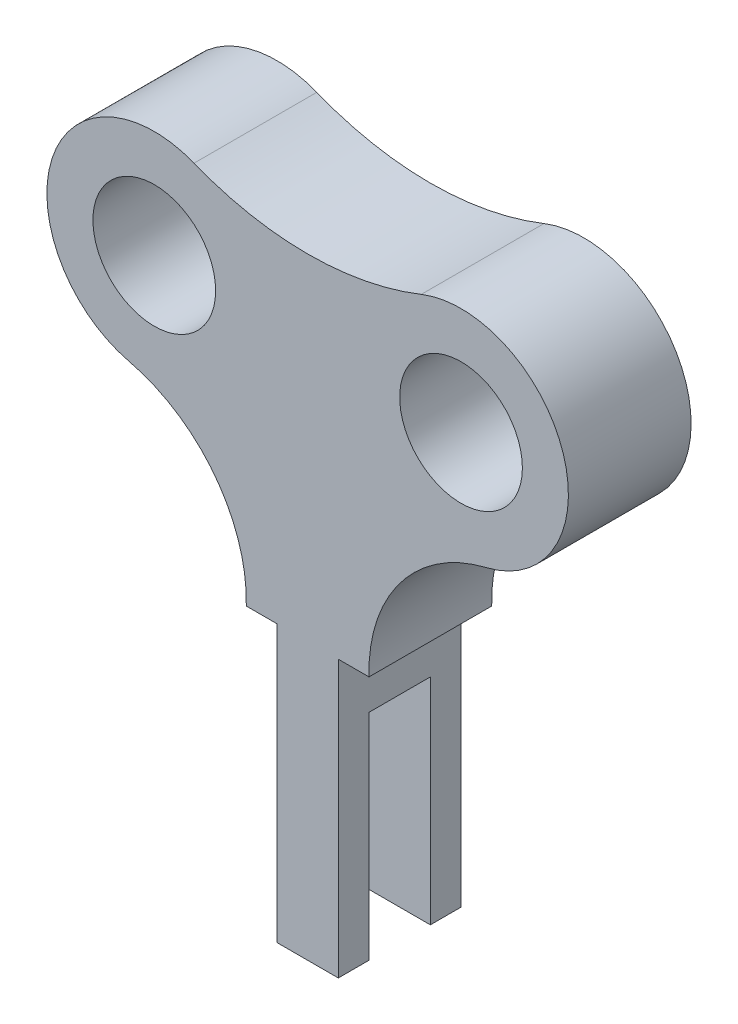
ISO-10303-21;
HEADER;
FILE_DESCRIPTION(('STEP AP214'),'2;1');
FILE_NAME('part.step','',(''),(''),'','','');
FILE_SCHEMA(('AUTOMOTIVE_DESIGN { 1 0 10303 214 1 1 1 1 }'));
ENDSEC;
DATA;
#1=APPLICATION_CONTEXT('core data for automotive mechanical design processes');
#2=APPLICATION_PROTOCOL_DEFINITION('international standard','automotive_design',2000,#1);
#3=PRODUCT_CONTEXT('',#1,'mechanical');
#4=PRODUCT('Part','Part','',(#3));
#5=PRODUCT_RELATED_PRODUCT_CATEGORY('part','',(#4));
#6=PRODUCT_DEFINITION_FORMATION('','',#4);
#7=PRODUCT_DEFINITION_CONTEXT('part definition',#1,'design');
#8=PRODUCT_DEFINITION('design','',#6,#7);
#9=PRODUCT_DEFINITION_SHAPE('','',#8);
#10=(LENGTH_UNIT() NAMED_UNIT(*) SI_UNIT(.MILLI.,.METRE.));
#11=(NAMED_UNIT(*) PLANE_ANGLE_UNIT() SI_UNIT($,.RADIAN.));
#12=(NAMED_UNIT(*) SI_UNIT($,.STERADIAN.) SOLID_ANGLE_UNIT());
#13=UNCERTAINTY_MEASURE_WITH_UNIT(LENGTH_MEASURE(1.E-05),#10,'distance_accuracy_value','');
#14=(GEOMETRIC_REPRESENTATION_CONTEXT(3) GLOBAL_UNCERTAINTY_ASSIGNED_CONTEXT((#13)) GLOBAL_UNIT_ASSIGNED_CONTEXT((#10,
#11,#12)) REPRESENTATION_CONTEXT('',''));
#15=CARTESIAN_POINT('',(0.,0.,0.));
#16=DIRECTION('',(0.,0.,1.));
#17=DIRECTION('',(1.,0.,0.));
#18=AXIS2_PLACEMENT_3D('',#15,#16,#17);
#19=CARTESIAN_POINT('',(5.,-50.1008204542105,-10.));
#20=DIRECTION('',(0.,-1.,0.));
#21=DIRECTION('',(0.,0.,-1.));
#22=AXIS2_PLACEMENT_3D('',#19,#20,#21);
#23=PLANE('',#22);
#24=DIRECTION('',(1.,0.,0.));
#25=VECTOR('',#24,1.);
#26=CARTESIAN_POINT('',(-5.,-50.1008204542105,-5.));
#27=LINE('',#26,#25);
#28=CARTESIAN_POINT('',(-5.,-50.1008204542105,-5.));
#29=VERTEX_POINT('',#28);
#30=CARTESIAN_POINT('',(5.,-50.1008204542105,-5.));
#31=VERTEX_POINT('',#30);
#32=EDGE_CURVE('E156',#29,#31,#27,.T.);
#33=ORIENTED_EDGE('',*,*,#32,.F.);
#34=DIRECTION('',(0.,0.,1.));
#35=VECTOR('',#34,1.);
#36=CARTESIAN_POINT('',(-5.,-50.1008204542105,-10.));
#37=LINE('',#36,#35);
#38=CARTESIAN_POINT('',(-5.,-50.1008204542105,-10.));
#39=VERTEX_POINT('',#38);
#40=EDGE_CURVE('E248',#39,#29,#37,.T.);
#41=ORIENTED_EDGE('',*,*,#40,.F.);
#42=DIRECTION('',(1.,0.,0.));
#43=VECTOR('',#42,1.);
#44=CARTESIAN_POINT('',(5.,-50.1008204542105,-10.));
#45=LINE('',#44,#43);
#46=CARTESIAN_POINT('',(5.,-50.1008204542105,-10.));
#47=VERTEX_POINT('',#46);
#48=EDGE_CURVE('E225',#39,#47,#45,.T.);
#49=ORIENTED_EDGE('',*,*,#48,.T.);
#50=DIRECTION('',(0.,0.,1.));
#51=VECTOR('',#50,1.);
#52=CARTESIAN_POINT('',(5.,-50.1008204542105,-10.));
#53=LINE('',#52,#51);
#54=EDGE_CURVE('E245',#47,#31,#53,.T.);
#55=ORIENTED_EDGE('',*,*,#54,.T.);
#56=EDGE_LOOP('',(#33,#41,#49,#55));
#57=FACE_BOUND('',#56,.T.);
#58=ADVANCED_FACE('F39',(#57),#23,.T.);
#59=CARTESIAN_POINT('',(0.,99.5988605657117,-10.));
#60=DIRECTION('',(0.,0.,1.));
#61=DIRECTION('',(1.,0.,0.));
#62=AXIS2_PLACEMENT_3D('',#59,#60,#61);
#63=CYLINDRICAL_SURFACE('',#62,50.);
#64=DIRECTION('',(0.,0.,1.));
#65=VECTOR('',#64,1.);
#66=CARTESIAN_POINT('',(-18.5185185185185,53.1546524028064,-10.));
#67=LINE('',#66,#65);
#68=CARTESIAN_POINT('',(-18.5185185185185,53.1546524028064,-10.));
#69=VERTEX_POINT('',#68);
#70=CARTESIAN_POINT('',(-18.5185185185185,53.1546524028064,10.));
#71=VERTEX_POINT('',#70);
#72=EDGE_CURVE('E43',#69,#71,#67,.T.);
#73=ORIENTED_EDGE('',*,*,#72,.T.);
#74=CARTESIAN_POINT('',(0.,99.5988605657117,10.));
#75=DIRECTION('',(0.,0.,-1.));
#76=DIRECTION('',(1.,0.,0.));
#77=AXIS2_PLACEMENT_3D('',#74,#75,#76);
#78=CIRCLE('',#77,50.);
#79=CARTESIAN_POINT('',(18.5185185185185,53.1546524028064,10.));
#80=VERTEX_POINT('',#79);
#81=EDGE_CURVE('E175',#80,#71,#78,.T.);
#82=ORIENTED_EDGE('',*,*,#81,.F.);
#83=DIRECTION('',(0.,0.,1.));
#84=VECTOR('',#83,1.);
#85=CARTESIAN_POINT('',(18.5185185185185,53.1546524028064,-10.));
#86=LINE('',#85,#84);
#87=CARTESIAN_POINT('',(18.5185185185185,53.1546524028064,-10.));
#88=VERTEX_POINT('',#87);
#89=EDGE_CURVE('E11',#88,#80,#86,.T.);
#90=ORIENTED_EDGE('',*,*,#89,.F.);
#91=CARTESIAN_POINT('',(0.,99.5988605657117,-10.));
#92=DIRECTION('',(0.,0.,-1.));
#93=DIRECTION('',(1.,0.,0.));
#94=AXIS2_PLACEMENT_3D('',#91,#92,#93);
#95=CIRCLE('',#94,50.);
#96=EDGE_CURVE('E211',#88,#69,#95,.T.);
#97=ORIENTED_EDGE('',*,*,#96,.T.);
#98=EDGE_LOOP('',(#73,#82,#90,#97));
#99=FACE_BOUND('',#98,.T.);
#100=ADVANCED_FACE('F41',(#99),#63,.F.);
#101=CARTESIAN_POINT('',(25.,36.8991795457895,-10.));
#102=DIRECTION('',(0.,0.,1.));
#103=DIRECTION('',(1.,0.,0.));
#104=AXIS2_PLACEMENT_3D('',#101,#102,#103);
#105=CYLINDRICAL_SURFACE('',#104,17.5);
#106=ORIENTED_EDGE('',*,*,#89,.T.);
#107=CARTESIAN_POINT('',(25.,36.8991795457895,10.));
#108=DIRECTION('',(0.,0.,1.));
#109=DIRECTION('',(1.,0.,0.));
#110=AXIS2_PLACEMENT_3D('',#107,#108,#109);
#111=CIRCLE('',#110,17.5);
#112=CARTESIAN_POINT('',(29.1137151317504,19.8895543936938,10.));
#113=VERTEX_POINT('',#112);
#114=EDGE_CURVE('E202',#113,#80,#111,.T.);
#115=ORIENTED_EDGE('',*,*,#114,.F.);
#116=DIRECTION('',(0.,0.,1.));
#117=VECTOR('',#116,1.);
#118=CARTESIAN_POINT('',(29.1137151317504,19.8895543936938,-10.));
#119=LINE('',#118,#117);
#120=CARTESIAN_POINT('',(29.1137151317504,19.8895543936938,-10.));
#121=VERTEX_POINT('',#120);
#122=EDGE_CURVE('E48',#121,#113,#119,.T.);
#123=ORIENTED_EDGE('',*,*,#122,.F.);
#124=CARTESIAN_POINT('',(25.,36.8991795457895,-10.));
#125=DIRECTION('',(0.,0.,1.));
#126=DIRECTION('',(1.,0.,0.));
#127=AXIS2_PLACEMENT_3D('',#124,#125,#126);
#128=CIRCLE('',#127,17.5);
#129=EDGE_CURVE('E237',#121,#88,#128,.T.);
#130=ORIENTED_EDGE('',*,*,#129,.T.);
#131=EDGE_LOOP('',(#106,#115,#123,#130));
#132=FACE_BOUND('',#131,.T.);
#133=ADVANCED_FACE('F267',(#132),#105,.T.);
#134=CARTESIAN_POINT('',(34.990451034251,-4.40991010930014,-10.));
#135=DIRECTION('',(0.,0.,1.));
#136=DIRECTION('',(1.,0.,0.));
#137=AXIS2_PLACEMENT_3D('',#134,#135,#136);
#138=CYLINDRICAL_SURFACE('',#137,25.);
#139=ORIENTED_EDGE('',*,*,#122,.T.);
#140=CARTESIAN_POINT('',(34.990451034251,-4.40991010930014,10.));
#141=DIRECTION('',(0.,0.,-1.));
#142=DIRECTION('',(1.,0.,0.));
#143=AXIS2_PLACEMENT_3D('',#140,#141,#142);
#144=CIRCLE('',#143,25.);
#145=CARTESIAN_POINT('',(9.99999999999999,-5.1008204542105,10.));
#146=VERTEX_POINT('',#145);
#147=EDGE_CURVE('E199',#146,#113,#144,.T.);
#148=ORIENTED_EDGE('',*,*,#147,.F.);
#149=DIRECTION('',(0.,0.,1.));
#150=VECTOR('',#149,1.);
#151=CARTESIAN_POINT('',(9.99999999999999,-5.1008204542105,-10.));
#152=LINE('',#151,#150);
#153=CARTESIAN_POINT('',(9.99999999999999,-5.1008204542105,-10.));
#154=VERTEX_POINT('',#153);
#155=EDGE_CURVE('E241',#154,#146,#152,.T.);
#156=ORIENTED_EDGE('',*,*,#155,.F.);
#157=CARTESIAN_POINT('',(34.990451034251,-4.40991010930014,-10.));
#158=DIRECTION('',(0.,0.,-1.));
#159=DIRECTION('',(1.,0.,0.));
#160=AXIS2_PLACEMENT_3D('',#157,#158,#159);
#161=CIRCLE('',#160,25.);
#162=EDGE_CURVE('E234',#154,#121,#161,.T.);
#163=ORIENTED_EDGE('',*,*,#162,.T.);
#164=EDGE_LOOP('',(#139,#148,#156,#163));
#165=FACE_BOUND('',#164,.T.);
#166=ADVANCED_FACE('F301',(#165),#138,.F.);
#167=CARTESIAN_POINT('',(4.99999999999999,-5.10082045421049,-10.));
#168=DIRECTION('',(0.,-1.,0.));
#169=DIRECTION('',(1.,0.,0.));
#170=AXIS2_PLACEMENT_3D('',#167,#168,#169);
#171=PLANE('',#170);
#172=ORIENTED_EDGE('',*,*,#155,.T.);
#173=DIRECTION('',(1.,0.,0.));
#174=VECTOR('',#173,1.);
#175=CARTESIAN_POINT('',(4.99999999999999,-5.10082045421049,10.));
#176=LINE('',#175,#174);
#177=CARTESIAN_POINT('',(4.99999999999999,-5.10082045421049,10.));
#178=VERTEX_POINT('',#177);
#179=EDGE_CURVE('E196',#178,#146,#176,.T.);
#180=ORIENTED_EDGE('',*,*,#179,.F.);
#181=DIRECTION('',(0.,0.,1.));
#182=VECTOR('',#181,1.);
#183=CARTESIAN_POINT('',(4.99999999999999,-5.10082045421049,-10.));
#184=LINE('',#183,#182);
#185=CARTESIAN_POINT('',(4.99999999999999,-5.10082045421049,-10.));
#186=VERTEX_POINT('',#185);
#187=EDGE_CURVE('E243',#186,#178,#184,.T.);
#188=ORIENTED_EDGE('',*,*,#187,.F.);
#189=DIRECTION('',(1.,0.,0.));
#190=VECTOR('',#189,1.);
#191=CARTESIAN_POINT('',(4.99999999999999,-5.10082045421049,-10.));
#192=LINE('',#191,#190);
#193=EDGE_CURVE('E231',#186,#154,#192,.T.);
#194=ORIENTED_EDGE('',*,*,#193,.T.);
#195=EDGE_LOOP('',(#172,#180,#188,#194));
#196=FACE_BOUND('',#195,.T.);
#197=ADVANCED_FACE('F299',(#196),#171,.T.);
#198=CARTESIAN_POINT('',(5.,-50.1008204542105,-10.));
#199=DIRECTION('',(1.,0.,0.));
#200=DIRECTION('',(0.,1.,0.));
#201=AXIS2_PLACEMENT_3D('',#198,#199,#200);
#202=PLANE('',#201);
#203=DIRECTION('',(0.,-1.,0.));
#204=VECTOR('',#203,1.);
#205=CARTESIAN_POINT('',(5.,-15.1008204542105,-5.));
#206=LINE('',#205,#204);
#207=CARTESIAN_POINT('',(5.,-15.1008204542105,-5.));
#208=VERTEX_POINT('',#207);
#209=EDGE_CURVE('E172',#208,#31,#206,.T.);
#210=ORIENTED_EDGE('',*,*,#209,.T.);
#211=ORIENTED_EDGE('',*,*,#54,.F.);
#212=DIRECTION('',(0.,1.,0.));
#213=VECTOR('',#212,1.);
#214=CARTESIAN_POINT('',(5.,-50.1008204542105,-10.));
#215=LINE('',#214,#213);
#216=EDGE_CURVE('E228',#47,#186,#215,.T.);
#217=ORIENTED_EDGE('',*,*,#216,.T.);
#218=ORIENTED_EDGE('',*,*,#187,.T.);
#219=DIRECTION('',(0.,1.,0.));
#220=VECTOR('',#219,1.);
#221=CARTESIAN_POINT('',(5.,-50.1008204542105,10.));
#222=LINE('',#221,#220);
#223=CARTESIAN_POINT('',(5.,-50.1008204542105,10.));
#224=VERTEX_POINT('',#223);
#225=EDGE_CURVE('E193',#224,#178,#222,.T.);
#226=ORIENTED_EDGE('',*,*,#225,.F.);
#227=CARTESIAN_POINT('',(5.,-50.1008204542105,5.));
#228=VERTEX_POINT('',#227);
#229=EDGE_CURVE('E161',#228,#224,#53,.T.);
#230=ORIENTED_EDGE('',*,*,#229,.F.);
#231=DIRECTION('',(0.,-1.,0.));
#232=VECTOR('',#231,1.);
#233=CARTESIAN_POINT('',(5.,-15.1008204542105,5.));
#234=LINE('',#233,#232);
#235=CARTESIAN_POINT('',(5.,-15.1008204542105,5.));
#236=VERTEX_POINT('',#235);
#237=EDGE_CURVE('E141',#236,#228,#234,.T.);
#238=ORIENTED_EDGE('',*,*,#237,.F.);
#239=DIRECTION('',(0.,0.,1.));
#240=VECTOR('',#239,1.);
#241=CARTESIAN_POINT('',(5.,-15.1008204542105,5.));
#242=LINE('',#241,#240);
#243=EDGE_CURVE('E147',#208,#236,#242,.T.);
#244=ORIENTED_EDGE('',*,*,#243,.F.);
#245=EDGE_LOOP('',(#210,#211,#217,#218,#226,#230,#238,#244));
#246=FACE_BOUND('',#245,.T.);
#247=ADVANCED_FACE('F159',(#246),#202,.T.);
#248=DIRECTION('',(-1.,0.,0.));
#249=VECTOR('',#248,1.);
#250=CARTESIAN_POINT('',(-5.,-50.1008204542105,5.));
#251=LINE('',#250,#249);
#252=CARTESIAN_POINT('',(-5.,-50.1008204542105,5.));
#253=VERTEX_POINT('',#252);
#254=EDGE_CURVE('E293',#228,#253,#251,.T.);
#255=ORIENTED_EDGE('',*,*,#254,.F.);
#256=ORIENTED_EDGE('',*,*,#229,.T.);
#257=DIRECTION('',(1.,0.,0.));
#258=VECTOR('',#257,1.);
#259=CARTESIAN_POINT('',(5.,-50.1008204542105,10.));
#260=LINE('',#259,#258);
#261=CARTESIAN_POINT('',(-5.,-50.1008204542105,10.));
#262=VERTEX_POINT('',#261);
#263=EDGE_CURVE('E190',#262,#224,#260,.T.);
#264=ORIENTED_EDGE('',*,*,#263,.F.);
#265=EDGE_CURVE('E251',#253,#262,#37,.T.);
#266=ORIENTED_EDGE('',*,*,#265,.F.);
#267=EDGE_LOOP('',(#255,#256,#264,#266));
#268=FACE_BOUND('',#267,.T.);
#269=ADVANCED_FACE('F312',(#268),#23,.T.);
#270=CARTESIAN_POINT('',(-5.,-50.1008204542105,-10.));
#271=DIRECTION('',(-1.,0.,0.));
#272=DIRECTION('',(0.,-1.,0.));
#273=AXIS2_PLACEMENT_3D('',#270,#271,#272);
#274=PLANE('',#273);
#275=DIRECTION('',(0.,-1.,0.));
#276=VECTOR('',#275,1.);
#277=CARTESIAN_POINT('',(-5.,-15.1008204542105,-5.));
#278=LINE('',#277,#276);
#279=CARTESIAN_POINT('',(-5.,-15.1008204542105,-5.));
#280=VERTEX_POINT('',#279);
#281=EDGE_CURVE('E163',#280,#29,#278,.T.);
#282=ORIENTED_EDGE('',*,*,#281,.F.);
#283=DIRECTION('',(0.,0.,-1.));
#284=VECTOR('',#283,1.);
#285=CARTESIAN_POINT('',(-5.,-15.1008204542105,5.));
#286=LINE('',#285,#284);
#287=CARTESIAN_POINT('',(-4.99999999999999,-15.1008204542105,5.));
#288=VERTEX_POINT('',#287);
#289=EDGE_CURVE('E146',#288,#280,#286,.T.);
#290=ORIENTED_EDGE('',*,*,#289,.F.);
#291=DIRECTION('',(0.,-1.,0.));
#292=VECTOR('',#291,1.);
#293=CARTESIAN_POINT('',(-5.,-15.1008204542105,5.));
#294=LINE('',#293,#292);
#295=EDGE_CURVE('E144',#288,#253,#294,.T.);
#296=ORIENTED_EDGE('',*,*,#295,.T.);
#297=ORIENTED_EDGE('',*,*,#265,.T.);
#298=DIRECTION('',(0.,-1.,0.));
#299=VECTOR('',#298,1.);
#300=CARTESIAN_POINT('',(-5.,-50.1008204542105,10.));
#301=LINE('',#300,#299);
#302=CARTESIAN_POINT('',(-4.99999999999999,-5.10082045421049,10.));
#303=VERTEX_POINT('',#302);
#304=EDGE_CURVE('E187',#303,#262,#301,.T.);
#305=ORIENTED_EDGE('',*,*,#304,.F.);
#306=DIRECTION('',(0.,0.,1.));
#307=VECTOR('',#306,1.);
#308=CARTESIAN_POINT('',(-4.99999999999999,-5.10082045421049,-10.));
#309=LINE('',#308,#307);
#310=CARTESIAN_POINT('',(-4.99999999999999,-5.10082045421049,-10.));
#311=VERTEX_POINT('',#310);
#312=EDGE_CURVE('E252',#311,#303,#309,.T.);
#313=ORIENTED_EDGE('',*,*,#312,.F.);
#314=DIRECTION('',(0.,-1.,0.));
#315=VECTOR('',#314,1.);
#316=CARTESIAN_POINT('',(-5.,-50.1008204542105,-10.));
#317=LINE('',#316,#315);
#318=EDGE_CURVE('E222',#311,#39,#317,.T.);
#319=ORIENTED_EDGE('',*,*,#318,.T.);
#320=ORIENTED_EDGE('',*,*,#40,.T.);
#321=EDGE_LOOP('',(#282,#290,#296,#297,#305,#313,#319,#320));
#322=FACE_BOUND('',#321,.T.);
#323=ADVANCED_FACE('F284',(#322),#274,.T.);
#324=CARTESIAN_POINT('',(-4.99999999999999,-5.10082045421049,-10.));
#325=DIRECTION('',(0.,-1.,0.));
#326=DIRECTION('',(1.,0.,0.));
#327=AXIS2_PLACEMENT_3D('',#324,#325,#326);
#328=PLANE('',#327);
#329=ORIENTED_EDGE('',*,*,#312,.T.);
#330=DIRECTION('',(1.,0.,0.));
#331=VECTOR('',#330,1.);
#332=CARTESIAN_POINT('',(-4.99999999999999,-5.10082045421049,10.));
#333=LINE('',#332,#331);
#334=CARTESIAN_POINT('',(-9.99999999999999,-5.10082045421049,10.));
#335=VERTEX_POINT('',#334);
#336=EDGE_CURVE('E184',#335,#303,#333,.T.);
#337=ORIENTED_EDGE('',*,*,#336,.F.);
#338=DIRECTION('',(0.,0.,1.));
#339=VECTOR('',#338,1.);
#340=CARTESIAN_POINT('',(-9.99999999999999,-5.10082045421049,-10.));
#341=LINE('',#340,#339);
#342=CARTESIAN_POINT('',(-9.99999999999999,-5.10082045421049,-10.));
#343=VERTEX_POINT('',#342);
#344=EDGE_CURVE('E254',#343,#335,#341,.T.);
#345=ORIENTED_EDGE('',*,*,#344,.F.);
#346=DIRECTION('',(1.,0.,0.));
#347=VECTOR('',#346,1.);
#348=CARTESIAN_POINT('',(-4.99999999999999,-5.10082045421049,-10.));
#349=LINE('',#348,#347);
#350=EDGE_CURVE('E219',#343,#311,#349,.T.);
#351=ORIENTED_EDGE('',*,*,#350,.T.);
#352=EDGE_LOOP('',(#329,#337,#345,#351));
#353=FACE_BOUND('',#352,.T.);
#354=ADVANCED_FACE('F281',(#353),#328,.T.);
#355=CARTESIAN_POINT('',(-34.990451034251,-4.40991010930014,-10.));
#356=DIRECTION('',(0.,0.,1.));
#357=DIRECTION('',(1.,0.,0.));
#358=AXIS2_PLACEMENT_3D('',#355,#356,#357);
#359=CYLINDRICAL_SURFACE('',#358,25.);
#360=ORIENTED_EDGE('',*,*,#344,.T.);
#361=CARTESIAN_POINT('',(-34.990451034251,-4.40991010930014,10.));
#362=DIRECTION('',(0.,0.,-1.));
#363=DIRECTION('',(-1.,0.,0.));
#364=AXIS2_PLACEMENT_3D('',#361,#362,#363);
#365=CIRCLE('',#364,25.);
#366=CARTESIAN_POINT('',(-29.1137151317504,19.8895543936938,10.));
#367=VERTEX_POINT('',#366);
#368=EDGE_CURVE('E181',#367,#335,#365,.T.);
#369=ORIENTED_EDGE('',*,*,#368,.F.);
#370=DIRECTION('',(0.,0.,1.));
#371=VECTOR('',#370,1.);
#372=CARTESIAN_POINT('',(-29.1137151317504,19.8895543936938,-10.));
#373=LINE('',#372,#371);
#374=CARTESIAN_POINT('',(-29.1137151317504,19.8895543936938,-10.));
#375=VERTEX_POINT('',#374);
#376=EDGE_CURVE('E255',#375,#367,#373,.T.);
#377=ORIENTED_EDGE('',*,*,#376,.F.);
#378=CARTESIAN_POINT('',(-34.990451034251,-4.40991010930014,-10.));
#379=DIRECTION('',(0.,0.,-1.));
#380=DIRECTION('',(-1.,0.,0.));
#381=AXIS2_PLACEMENT_3D('',#378,#379,#380);
#382=CIRCLE('',#381,25.);
#383=EDGE_CURVE('E216',#375,#343,#382,.T.);
#384=ORIENTED_EDGE('',*,*,#383,.T.);
#385=EDGE_LOOP('',(#360,#369,#377,#384));
#386=FACE_BOUND('',#385,.T.);
#387=ADVANCED_FACE('F277',(#386),#359,.F.);
#388=CARTESIAN_POINT('',(-25.,36.8991795457895,-10.));
#389=DIRECTION('',(0.,0.,1.));
#390=DIRECTION('',(1.,0.,0.));
#391=AXIS2_PLACEMENT_3D('',#388,#389,#390);
#392=CYLINDRICAL_SURFACE('',#391,17.5);
#393=ORIENTED_EDGE('',*,*,#376,.T.);
#394=CARTESIAN_POINT('',(-25.,36.8991795457895,10.));
#395=DIRECTION('',(0.,0.,1.));
#396=DIRECTION('',(1.,0.,0.));
#397=AXIS2_PLACEMENT_3D('',#394,#395,#396);
#398=CIRCLE('',#397,17.5);
#399=EDGE_CURVE('E178',#71,#367,#398,.T.);
#400=ORIENTED_EDGE('',*,*,#399,.F.);
#401=ORIENTED_EDGE('',*,*,#72,.F.);
#402=CARTESIAN_POINT('',(-25.,36.8991795457895,-10.));
#403=DIRECTION('',(0.,0.,1.));
#404=DIRECTION('',(1.,0.,0.));
#405=AXIS2_PLACEMENT_3D('',#402,#403,#404);
#406=CIRCLE('',#405,17.5);
#407=EDGE_CURVE('E213',#69,#375,#406,.T.);
#408=ORIENTED_EDGE('',*,*,#407,.T.);
#409=EDGE_LOOP('',(#393,#400,#401,#408));
#410=FACE_BOUND('',#409,.T.);
#411=ADVANCED_FACE('F259',(#410),#392,.T.);
#412=CARTESIAN_POINT('',(0.,99.5988605657117,-10.));
#413=DIRECTION('',(0.,0.,1.));
#414=DIRECTION('',(1.,0.,0.));
#415=AXIS2_PLACEMENT_3D('',#412,#413,#414);
#416=PLANE('',#415);
#417=CARTESIAN_POINT('',(25.,36.8991795457895,-10.));
#418=DIRECTION('',(0.,0.,1.));
#419=DIRECTION('',(1.,0.,0.));
#420=AXIS2_PLACEMENT_3D('',#417,#418,#419);
#421=CIRCLE('',#420,10.);
#422=CARTESIAN_POINT('',(35.,36.8991795457895,-10.));
#423=VERTEX_POINT('',#422);
#424=EDGE_CURVE('E205',#423,#423,#421,.T.);
#425=ORIENTED_EDGE('',*,*,#424,.T.);
#426=EDGE_LOOP('',(#425));
#427=FACE_BOUND('',#426,.T.);
#428=CARTESIAN_POINT('',(-25.,36.8991795457895,-10.));
#429=DIRECTION('',(0.,0.,1.));
#430=DIRECTION('',(1.,0.,0.));
#431=AXIS2_PLACEMENT_3D('',#428,#429,#430);
#432=CIRCLE('',#431,10.);
#433=CARTESIAN_POINT('',(-15.,36.8991795457895,-10.));
#434=VERTEX_POINT('',#433);
#435=EDGE_CURVE('E208',#434,#434,#432,.T.);
#436=ORIENTED_EDGE('',*,*,#435,.T.);
#437=EDGE_LOOP('',(#436));
#438=FACE_BOUND('',#437,.T.);
#439=ORIENTED_EDGE('',*,*,#96,.F.);
#440=ORIENTED_EDGE('',*,*,#129,.F.);
#441=ORIENTED_EDGE('',*,*,#162,.F.);
#442=ORIENTED_EDGE('',*,*,#193,.F.);
#443=ORIENTED_EDGE('',*,*,#216,.F.);
#444=ORIENTED_EDGE('',*,*,#48,.F.);
#445=ORIENTED_EDGE('',*,*,#318,.F.);
#446=ORIENTED_EDGE('',*,*,#350,.F.);
#447=ORIENTED_EDGE('',*,*,#383,.F.);
#448=ORIENTED_EDGE('',*,*,#407,.F.);
#449=EDGE_LOOP('',(#439,#440,#441,#442,#443,#444,#445,#446,#447,#448));
#450=FACE_BOUND('',#449,.T.);
#451=ADVANCED_FACE('F271',(#427,#438,#450),#416,.F.);
#452=CARTESIAN_POINT('',(-25.,36.8991795457895,-10.));
#453=DIRECTION('',(0.,0.,1.));
#454=DIRECTION('',(1.,0.,0.));
#455=AXIS2_PLACEMENT_3D('',#452,#453,#454);
#456=CYLINDRICAL_SURFACE('',#455,10.);
#457=ORIENTED_EDGE('',*,*,#435,.F.);
#458=EDGE_LOOP('',(#457));
#459=FACE_BOUND('',#458,.T.);
#460=CARTESIAN_POINT('',(-25.,36.8991795457895,10.));
#461=DIRECTION('',(0.,0.,1.));
#462=DIRECTION('',(1.,0.,0.));
#463=AXIS2_PLACEMENT_3D('',#460,#461,#462);
#464=CIRCLE('',#463,10.);
#465=CARTESIAN_POINT('',(-15.,36.8991795457895,10.));
#466=VERTEX_POINT('',#465);
#467=EDGE_CURVE('E171',#466,#466,#464,.T.);
#468=ORIENTED_EDGE('',*,*,#467,.T.);
#469=EDGE_LOOP('',(#468));
#470=FACE_BOUND('',#469,.T.);
#471=ADVANCED_FACE('F376',(#459,#470),#456,.F.);
#472=CARTESIAN_POINT('',(25.,36.8991795457895,-10.));
#473=DIRECTION('',(0.,0.,1.));
#474=DIRECTION('',(1.,0.,0.));
#475=AXIS2_PLACEMENT_3D('',#472,#473,#474);
#476=CYLINDRICAL_SURFACE('',#475,10.);
#477=ORIENTED_EDGE('',*,*,#424,.F.);
#478=EDGE_LOOP('',(#477));
#479=FACE_BOUND('',#478,.T.);
#480=CARTESIAN_POINT('',(25.,36.8991795457895,10.));
#481=DIRECTION('',(0.,0.,1.));
#482=DIRECTION('',(1.,0.,0.));
#483=AXIS2_PLACEMENT_3D('',#480,#481,#482);
#484=CIRCLE('',#483,10.);
#485=CARTESIAN_POINT('',(35.,36.8991795457895,10.));
#486=VERTEX_POINT('',#485);
#487=EDGE_CURVE('E168',#486,#486,#484,.T.);
#488=ORIENTED_EDGE('',*,*,#487,.T.);
#489=EDGE_LOOP('',(#488));
#490=FACE_BOUND('',#489,.T.);
#491=ADVANCED_FACE('F386',(#479,#490),#476,.F.);
#492=CARTESIAN_POINT('',(0.,99.5988605657117,10.));
#493=DIRECTION('',(0.,0.,1.));
#494=DIRECTION('',(1.,0.,0.));
#495=AXIS2_PLACEMENT_3D('',#492,#493,#494);
#496=PLANE('',#495);
#497=ORIENTED_EDGE('',*,*,#467,.F.);
#498=EDGE_LOOP('',(#497));
#499=FACE_BOUND('',#498,.T.);
#500=ORIENTED_EDGE('',*,*,#81,.T.);
#501=ORIENTED_EDGE('',*,*,#399,.T.);
#502=ORIENTED_EDGE('',*,*,#368,.T.);
#503=ORIENTED_EDGE('',*,*,#336,.T.);
#504=ORIENTED_EDGE('',*,*,#304,.T.);
#505=ORIENTED_EDGE('',*,*,#263,.T.);
#506=ORIENTED_EDGE('',*,*,#225,.T.);
#507=ORIENTED_EDGE('',*,*,#179,.T.);
#508=ORIENTED_EDGE('',*,*,#147,.T.);
#509=ORIENTED_EDGE('',*,*,#114,.T.);
#510=EDGE_LOOP('',(#500,#501,#502,#503,#504,#505,#506,#507,#508,#509));
#511=FACE_BOUND('',#510,.T.);
#512=ORIENTED_EDGE('',*,*,#487,.F.);
#513=EDGE_LOOP('',(#512));
#514=FACE_BOUND('',#513,.T.);
#515=ADVANCED_FACE('F262',(#499,#511,#514),#496,.T.);
#516=CARTESIAN_POINT('',(-5.,-15.1008204542105,-5.));
#517=DIRECTION('',(0.,0.,-1.));
#518=DIRECTION('',(-1.,0.,0.));
#519=AXIS2_PLACEMENT_3D('',#516,#517,#518);
#520=PLANE('',#519);
#521=ORIENTED_EDGE('',*,*,#32,.T.);
#522=ORIENTED_EDGE('',*,*,#209,.F.);
#523=DIRECTION('',(1.,0.,0.));
#524=VECTOR('',#523,1.);
#525=CARTESIAN_POINT('',(-5.,-15.1008204542105,-5.));
#526=LINE('',#525,#524);
#527=EDGE_CURVE('E153',#280,#208,#526,.T.);
#528=ORIENTED_EDGE('',*,*,#527,.F.);
#529=ORIENTED_EDGE('',*,*,#281,.T.);
#530=EDGE_LOOP('',(#521,#522,#528,#529));
#531=FACE_BOUND('',#530,.T.);
#532=ADVANCED_FACE('F295',(#531),#520,.F.);
#533=CARTESIAN_POINT('',(-5.,-15.1008204542105,5.));
#534=DIRECTION('',(0.,0.,1.));
#535=DIRECTION('',(1.,0.,0.));
#536=AXIS2_PLACEMENT_3D('',#533,#534,#535);
#537=PLANE('',#536);
#538=ORIENTED_EDGE('',*,*,#254,.T.);
#539=ORIENTED_EDGE('',*,*,#295,.F.);
#540=DIRECTION('',(-1.,0.,0.));
#541=VECTOR('',#540,1.);
#542=CARTESIAN_POINT('',(-5.,-15.1008204542105,5.));
#543=LINE('',#542,#541);
#544=EDGE_CURVE('E56',#236,#288,#543,.T.);
#545=ORIENTED_EDGE('',*,*,#544,.F.);
#546=ORIENTED_EDGE('',*,*,#237,.T.);
#547=EDGE_LOOP('',(#538,#539,#545,#546));
#548=FACE_BOUND('',#547,.T.);
#549=ADVANCED_FACE('F139',(#548),#537,.F.);
#550=CARTESIAN_POINT('',(0.,-15.1008204542105,0.));
#551=DIRECTION('',(0.,-1.,0.));
#552=DIRECTION('',(0.,0.,-1.));
#553=AXIS2_PLACEMENT_3D('',#550,#551,#552);
#554=PLANE('',#553);
#555=ORIENTED_EDGE('',*,*,#243,.T.);
#556=ORIENTED_EDGE('',*,*,#544,.T.);
#557=ORIENTED_EDGE('',*,*,#289,.T.);
#558=ORIENTED_EDGE('',*,*,#527,.T.);
#559=EDGE_LOOP('',(#555,#556,#557,#558));
#560=FACE_BOUND('',#559,.T.);
#561=ADVANCED_FACE('F151',(#560),#554,.T.);
#562=CLOSED_SHELL('',(#58,#100,#133,#166,#197,#247,#269,#323,#354,#387,#411,#451,#471,#491,#515,
#532,#549,#561));
#563=MANIFOLD_SOLID_BREP('B2',#562);
#564=ADVANCED_BREP_SHAPE_REPRESENTATION('',(#18,#563),#14);
#565=SHAPE_DEFINITION_REPRESENTATION(#9,#564);
ENDSEC;
END-ISO-10303-21;
